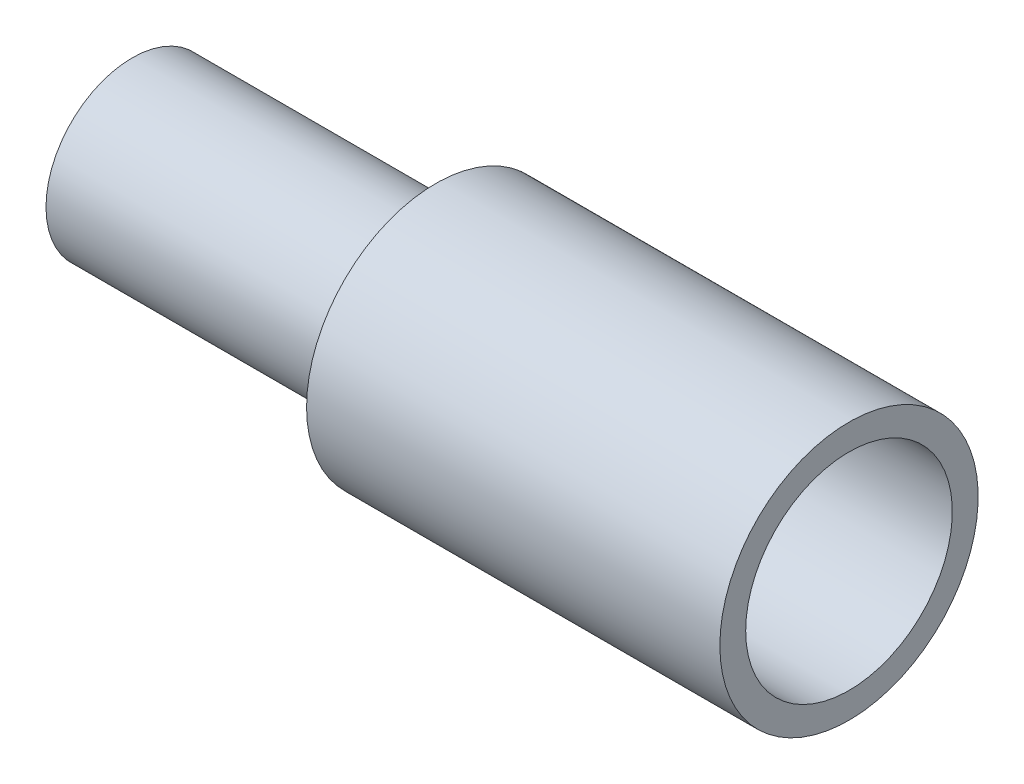
ISO-10303-21;
HEADER;
FILE_DESCRIPTION(('STEP AP214'),'2;1');
FILE_NAME('part.step','',(''),(''),'','','');
FILE_SCHEMA(('AUTOMOTIVE_DESIGN { 1 0 10303 214 1 1 1 1 }'));
ENDSEC;
DATA;
#1=APPLICATION_CONTEXT('core data for automotive mechanical design processes');
#2=APPLICATION_PROTOCOL_DEFINITION('international standard','automotive_design',2000,#1);
#3=PRODUCT_CONTEXT('',#1,'mechanical');
#4=PRODUCT('Part','Part','',(#3));
#5=PRODUCT_RELATED_PRODUCT_CATEGORY('part','',(#4));
#6=PRODUCT_DEFINITION_FORMATION('','',#4);
#7=PRODUCT_DEFINITION_CONTEXT('part definition',#1,'design');
#8=PRODUCT_DEFINITION('design','',#6,#7);
#9=PRODUCT_DEFINITION_SHAPE('','',#8);
#10=(LENGTH_UNIT() NAMED_UNIT(*) SI_UNIT(.MILLI.,.METRE.));
#11=(NAMED_UNIT(*) PLANE_ANGLE_UNIT() SI_UNIT($,.RADIAN.));
#12=(NAMED_UNIT(*) SI_UNIT($,.STERADIAN.) SOLID_ANGLE_UNIT());
#13=UNCERTAINTY_MEASURE_WITH_UNIT(LENGTH_MEASURE(1.E-05),#10,'distance_accuracy_value','');
#14=(GEOMETRIC_REPRESENTATION_CONTEXT(3) GLOBAL_UNCERTAINTY_ASSIGNED_CONTEXT((#13)) GLOBAL_UNIT_ASSIGNED_CONTEXT((#10,
#11,#12)) REPRESENTATION_CONTEXT('',''));
#15=CARTESIAN_POINT('',(0.,0.,0.));
#16=DIRECTION('',(0.,0.,1.));
#17=DIRECTION('',(1.,0.,0.));
#18=AXIS2_PLACEMENT_3D('',#15,#16,#17);
#19=CARTESIAN_POINT('',(-19.2145524963278,0.,0.));
#20=DIRECTION('',(-1.,0.,0.));
#21=DIRECTION('',(0.,0.,1.));
#22=AXIS2_PLACEMENT_3D('',#19,#20,#21);
#23=CYLINDRICAL_SURFACE('',#22,13.35);
#24=CARTESIAN_POINT('',(27.7854475036722,0.,0.));
#25=DIRECTION('',(-1.,0.,0.));
#26=DIRECTION('',(0.,0.,1.));
#27=AXIS2_PLACEMENT_3D('',#24,#25,#26);
#28=CIRCLE('',#27,13.35);
#29=CARTESIAN_POINT('',(27.7854475036722,0.,13.35));
#30=VERTEX_POINT('',#29);
#31=EDGE_CURVE('E69',#30,#30,#28,.T.);
#32=ORIENTED_EDGE('',*,*,#31,.T.);
#33=EDGE_LOOP('',(#32));
#34=FACE_BOUND('',#33,.T.);
#35=CARTESIAN_POINT('',(-19.2145524963278,0.,0.));
#36=DIRECTION('',(-1.,0.,0.));
#37=DIRECTION('',(0.,0.,1.));
#38=AXIS2_PLACEMENT_3D('',#35,#36,#37);
#39=CIRCLE('',#38,13.35);
#40=CARTESIAN_POINT('',(-19.2145524963278,0.,13.35));
#41=VERTEX_POINT('',#40);
#42=EDGE_CURVE('E10',#41,#41,#39,.T.);
#43=ORIENTED_EDGE('',*,*,#42,.F.);
#44=EDGE_LOOP('',(#43));
#45=FACE_BOUND('',#44,.T.);
#46=ADVANCED_FACE('F41',(#34,#45),#23,.T.);
#47=CARTESIAN_POINT('',(-19.2145524963278,0.,0.));
#48=DIRECTION('',(1.,0.,0.));
#49=DIRECTION('',(0.,0.,-1.));
#50=AXIS2_PLACEMENT_3D('',#47,#48,#49);
#51=PLANE('',#50);
#52=CARTESIAN_POINT('',(-19.2145524963278,0.,0.));
#53=DIRECTION('',(-1.,0.,0.));
#54=DIRECTION('',(0.,0.,1.));
#55=AXIS2_PLACEMENT_3D('',#52,#53,#54);
#56=CIRCLE('',#55,9.35);
#57=CARTESIAN_POINT('',(-19.2145524963278,0.,9.35));
#58=VERTEX_POINT('',#57);
#59=EDGE_CURVE('E47',#58,#58,#56,.T.);
#60=ORIENTED_EDGE('',*,*,#59,.F.);
#61=EDGE_LOOP('',(#60));
#62=FACE_BOUND('',#61,.T.);
#63=ORIENTED_EDGE('',*,*,#42,.T.);
#64=EDGE_LOOP('',(#63));
#65=FACE_BOUND('',#64,.T.);
#66=ADVANCED_FACE('F93',(#62,#65),#51,.F.);
#67=CARTESIAN_POINT('',(-19.2145524963278,0.,0.));
#68=DIRECTION('',(-1.,0.,0.));
#69=DIRECTION('',(0.,0.,1.));
#70=AXIS2_PLACEMENT_3D('',#67,#68,#69);
#71=CYLINDRICAL_SURFACE('',#70,9.35);
#72=CARTESIAN_POINT('',(31.7854475036722,0.,0.));
#73=DIRECTION('',(-1.,0.,0.));
#74=DIRECTION('',(0.,0.,1.));
#75=AXIS2_PLACEMENT_3D('',#72,#73,#74);
#76=CIRCLE('',#75,9.35);
#77=CARTESIAN_POINT('',(31.7854475036722,0.,9.35));
#78=VERTEX_POINT('',#77);
#79=EDGE_CURVE('E51',#78,#78,#76,.T.);
#80=ORIENTED_EDGE('',*,*,#79,.F.);
#81=EDGE_LOOP('',(#80));
#82=FACE_BOUND('',#81,.T.);
#83=ORIENTED_EDGE('',*,*,#59,.T.);
#84=EDGE_LOOP('',(#83));
#85=FACE_BOUND('',#84,.T.);
#86=ADVANCED_FACE('F97',(#82,#85),#71,.F.);
#87=CARTESIAN_POINT('',(31.7854475036722,0.,0.));
#88=DIRECTION('',(-1.,0.,0.));
#89=DIRECTION('',(0.,0.,1.));
#90=AXIS2_PLACEMENT_3D('',#87,#88,#89);
#91=PLANE('',#90);
#92=CARTESIAN_POINT('',(31.7854475036722,0.,0.));
#93=DIRECTION('',(-1.,0.,0.));
#94=DIRECTION('',(0.,0.,1.));
#95=AXIS2_PLACEMENT_3D('',#92,#93,#94);
#96=CIRCLE('',#95,16.);
#97=CARTESIAN_POINT('',(31.7854475036722,0.,16.));
#98=VERTEX_POINT('',#97);
#99=EDGE_CURVE('E55',#98,#98,#96,.T.);
#100=ORIENTED_EDGE('',*,*,#99,.F.);
#101=EDGE_LOOP('',(#100));
#102=FACE_BOUND('',#101,.T.);
#103=ORIENTED_EDGE('',*,*,#79,.T.);
#104=EDGE_LOOP('',(#103));
#105=FACE_BOUND('',#104,.T.);
#106=ADVANCED_FACE('F102',(#102,#105),#91,.F.);
#107=CARTESIAN_POINT('',(-19.2145524963278,0.,0.));
#108=DIRECTION('',(-1.,0.,0.));
#109=DIRECTION('',(0.,0.,1.));
#110=AXIS2_PLACEMENT_3D('',#107,#108,#109);
#111=CYLINDRICAL_SURFACE('',#110,16.);
#112=ORIENTED_EDGE('',*,*,#99,.T.);
#113=EDGE_LOOP('',(#112));
#114=FACE_BOUND('',#113,.T.);
#115=CARTESIAN_POINT('',(91.7854475036721,0.,0.));
#116=DIRECTION('',(-1.,0.,0.));
#117=DIRECTION('',(0.,0.,1.));
#118=AXIS2_PLACEMENT_3D('',#115,#116,#117);
#119=CIRCLE('',#118,16.);
#120=CARTESIAN_POINT('',(91.7854475036721,0.,16.));
#121=VERTEX_POINT('',#120);
#122=EDGE_CURVE('E60',#121,#121,#119,.T.);
#123=ORIENTED_EDGE('',*,*,#122,.F.);
#124=EDGE_LOOP('',(#123));
#125=FACE_BOUND('',#124,.T.);
#126=ADVANCED_FACE('F89',(#114,#125),#111,.F.);
#127=CARTESIAN_POINT('',(91.7854475036721,0.,0.));
#128=DIRECTION('',(1.,0.,0.));
#129=DIRECTION('',(0.,0.,-1.));
#130=AXIS2_PLACEMENT_3D('',#127,#128,#129);
#131=PLANE('',#130);
#132=ORIENTED_EDGE('',*,*,#122,.T.);
#133=EDGE_LOOP('',(#132));
#134=FACE_BOUND('',#133,.T.);
#135=CARTESIAN_POINT('',(91.7854475036721,0.,0.));
#136=DIRECTION('',(-1.,0.,0.));
#137=DIRECTION('',(0.,0.,1.));
#138=AXIS2_PLACEMENT_3D('',#135,#136,#137);
#139=CIRCLE('',#138,20.);
#140=CARTESIAN_POINT('',(91.7854475036721,0.,20.));
#141=VERTEX_POINT('',#140);
#142=EDGE_CURVE('E63',#141,#141,#139,.T.);
#143=ORIENTED_EDGE('',*,*,#142,.F.);
#144=EDGE_LOOP('',(#143));
#145=FACE_BOUND('',#144,.T.);
#146=ADVANCED_FACE('F83',(#134,#145),#131,.T.);
#147=CARTESIAN_POINT('',(-19.2145524963278,0.,0.));
#148=DIRECTION('',(-1.,0.,0.));
#149=DIRECTION('',(0.,0.,1.));
#150=AXIS2_PLACEMENT_3D('',#147,#148,#149);
#151=CYLINDRICAL_SURFACE('',#150,20.);
#152=ORIENTED_EDGE('',*,*,#142,.T.);
#153=EDGE_LOOP('',(#152));
#154=FACE_BOUND('',#153,.T.);
#155=CARTESIAN_POINT('',(27.7854475036722,0.,0.));
#156=DIRECTION('',(-1.,0.,0.));
#157=DIRECTION('',(0.,0.,1.));
#158=AXIS2_PLACEMENT_3D('',#155,#156,#157);
#159=CIRCLE('',#158,20.);
#160=CARTESIAN_POINT('',(27.7854475036722,0.,20.));
#161=VERTEX_POINT('',#160);
#162=EDGE_CURVE('E66',#161,#161,#159,.T.);
#163=ORIENTED_EDGE('',*,*,#162,.F.);
#164=EDGE_LOOP('',(#163));
#165=FACE_BOUND('',#164,.T.);
#166=ADVANCED_FACE('F78',(#154,#165),#151,.T.);
#167=CARTESIAN_POINT('',(27.7854475036722,0.,0.));
#168=DIRECTION('',(1.,0.,0.));
#169=DIRECTION('',(0.,0.,-1.));
#170=AXIS2_PLACEMENT_3D('',#167,#168,#169);
#171=PLANE('',#170);
#172=ORIENTED_EDGE('',*,*,#31,.F.);
#173=EDGE_LOOP('',(#172));
#174=FACE_BOUND('',#173,.T.);
#175=ORIENTED_EDGE('',*,*,#162,.T.);
#176=EDGE_LOOP('',(#175));
#177=FACE_BOUND('',#176,.T.);
#178=ADVANCED_FACE('F75',(#174,#177),#171,.F.);
#179=CLOSED_SHELL('',(#46,#66,#86,#106,#126,#146,#166,#178));
#180=MANIFOLD_SOLID_BREP('B2',#179);
#181=ADVANCED_BREP_SHAPE_REPRESENTATION('',(#18,#180),#14);
#182=SHAPE_DEFINITION_REPRESENTATION(#9,#181);
ENDSEC;
END-ISO-10303-21;
